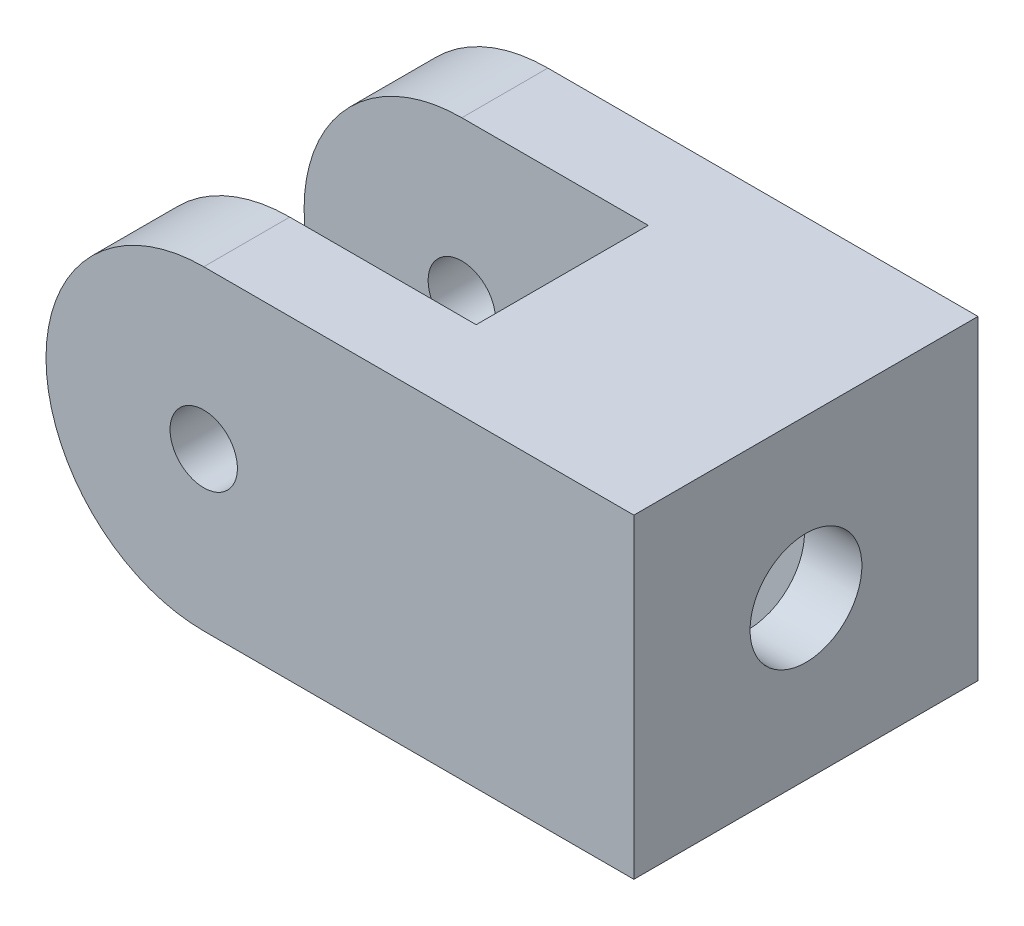
ISO-10303-21;
HEADER;
FILE_DESCRIPTION(('STEP AP214'),'2;1');
FILE_NAME('part.step','',(''),(''),'','','');
FILE_SCHEMA(('AUTOMOTIVE_DESIGN { 1 0 10303 214 1 1 1 1 }'));
ENDSEC;
DATA;
#1=APPLICATION_CONTEXT('core data for automotive mechanical design processes');
#2=APPLICATION_PROTOCOL_DEFINITION('international standard','automotive_design',2000,#1);
#3=PRODUCT_CONTEXT('',#1,'mechanical');
#4=PRODUCT('Part','Part','',(#3));
#5=PRODUCT_RELATED_PRODUCT_CATEGORY('part','',(#4));
#6=PRODUCT_DEFINITION_FORMATION('','',#4);
#7=PRODUCT_DEFINITION_CONTEXT('part definition',#1,'design');
#8=PRODUCT_DEFINITION('design','',#6,#7);
#9=PRODUCT_DEFINITION_SHAPE('','',#8);
#10=(LENGTH_UNIT() NAMED_UNIT(*) SI_UNIT(.MILLI.,.METRE.));
#11=(NAMED_UNIT(*) PLANE_ANGLE_UNIT() SI_UNIT($,.RADIAN.));
#12=(NAMED_UNIT(*) SI_UNIT($,.STERADIAN.) SOLID_ANGLE_UNIT());
#13=UNCERTAINTY_MEASURE_WITH_UNIT(LENGTH_MEASURE(1.E-05),#10,'distance_accuracy_value','');
#14=(GEOMETRIC_REPRESENTATION_CONTEXT(3) GLOBAL_UNCERTAINTY_ASSIGNED_CONTEXT((#13)) GLOBAL_UNIT_ASSIGNED_CONTEXT((#10,
#11,#12)) REPRESENTATION_CONTEXT('',''));
#15=CARTESIAN_POINT('',(0.,0.,0.));
#16=DIRECTION('',(0.,0.,1.));
#17=DIRECTION('',(1.,0.,0.));
#18=AXIS2_PLACEMENT_3D('',#15,#16,#17);
#19=CARTESIAN_POINT('',(30.,-11.,0.));
#20=DIRECTION('',(0.,-1.,0.));
#21=DIRECTION('',(0.,0.,-1.));
#22=AXIS2_PLACEMENT_3D('',#19,#20,#21);
#23=PLANE('',#22);
#24=DIRECTION('',(-1.,0.,0.));
#25=VECTOR('',#24,1.);
#26=CARTESIAN_POINT('',(13.,-11.,-18.));
#27=LINE('',#26,#25);
#28=CARTESIAN_POINT('',(13.,-11.,-18.));
#29=VERTEX_POINT('',#28);
#30=CARTESIAN_POINT('',(0.,-11.,-18.));
#31=VERTEX_POINT('',#30);
#32=EDGE_CURVE('E200',#29,#31,#27,.T.);
#33=ORIENTED_EDGE('',*,*,#32,.T.);
#34=DIRECTION('',(0.,0.,-1.));
#35=VECTOR('',#34,1.);
#36=CARTESIAN_POINT('',(0.,-11.,0.));
#37=LINE('',#36,#35);
#38=CARTESIAN_POINT('',(0.,-11.,-24.));
#39=VERTEX_POINT('',#38);
#40=EDGE_CURVE('E266',#31,#39,#37,.T.);
#41=ORIENTED_EDGE('',*,*,#40,.T.);
#42=DIRECTION('',(-1.,0.,0.));
#43=VECTOR('',#42,1.);
#44=CARTESIAN_POINT('',(30.,-11.,-24.));
#45=LINE('',#44,#43);
#46=CARTESIAN_POINT('',(30.,-11.,-24.));
#47=VERTEX_POINT('',#46);
#48=EDGE_CURVE('E236',#47,#39,#45,.T.);
#49=ORIENTED_EDGE('',*,*,#48,.F.);
#50=DIRECTION('',(0.,0.,-1.));
#51=VECTOR('',#50,1.);
#52=CARTESIAN_POINT('',(30.,-11.,0.));
#53=LINE('',#52,#51);
#54=CARTESIAN_POINT('',(30.,-11.,0.));
#55=VERTEX_POINT('',#54);
#56=EDGE_CURVE('E267',#55,#47,#53,.T.);
#57=ORIENTED_EDGE('',*,*,#56,.F.);
#58=DIRECTION('',(-1.,0.,0.));
#59=VECTOR('',#58,1.);
#60=CARTESIAN_POINT('',(30.,-11.,0.));
#61=LINE('',#60,#59);
#62=CARTESIAN_POINT('',(0.,-11.,0.));
#63=VERTEX_POINT('',#62);
#64=EDGE_CURVE('E244',#55,#63,#61,.T.);
#65=ORIENTED_EDGE('',*,*,#64,.T.);
#66=CARTESIAN_POINT('',(0.,-11.,-5.99999999999999));
#67=VERTEX_POINT('',#66);
#68=EDGE_CURVE('E48',#63,#67,#37,.T.);
#69=ORIENTED_EDGE('',*,*,#68,.T.);
#70=DIRECTION('',(1.,0.,0.));
#71=VECTOR('',#70,1.);
#72=CARTESIAN_POINT('',(-17.11080660068,-11.,-5.99999999999999));
#73=LINE('',#72,#71);
#74=CARTESIAN_POINT('',(13.,-11.,-5.99999999999999));
#75=VERTEX_POINT('',#74);
#76=EDGE_CURVE('E204',#67,#75,#73,.T.);
#77=ORIENTED_EDGE('',*,*,#76,.T.);
#78=DIRECTION('',(0.,0.,-1.));
#79=VECTOR('',#78,1.);
#80=CARTESIAN_POINT('',(13.,-11.,-5.99999999999999));
#81=LINE('',#80,#79);
#82=EDGE_CURVE('E209',#75,#29,#81,.T.);
#83=ORIENTED_EDGE('',*,*,#82,.T.);
#84=EDGE_LOOP('',(#33,#41,#49,#57,#65,#69,#77,#83));
#85=FACE_BOUND('',#84,.T.);
#86=DIRECTION('',(-1.,0.,0.));
#87=VECTOR('',#86,1.);
#88=CARTESIAN_POINT('',(26.,-11.,-5.5));
#89=LINE('',#88,#87);
#90=CARTESIAN_POINT('',(26.,-11.,-5.5));
#91=VERTEX_POINT('',#90);
#92=CARTESIAN_POINT('',(19.2,-11.,-5.5));
#93=VERTEX_POINT('',#92);
#94=EDGE_CURVE('E147',#91,#93,#89,.T.);
#95=ORIENTED_EDGE('',*,*,#94,.F.);
#96=DIRECTION('',(0.,0.,1.));
#97=VECTOR('',#96,1.);
#98=CARTESIAN_POINT('',(26.,-11.,-18.5));
#99=LINE('',#98,#97);
#100=CARTESIAN_POINT('',(26.,-11.,-18.5));
#101=VERTEX_POINT('',#100);
#102=EDGE_CURVE('E154',#101,#91,#99,.T.);
#103=ORIENTED_EDGE('',*,*,#102,.F.);
#104=DIRECTION('',(-1.,0.,0.));
#105=VECTOR('',#104,1.);
#106=CARTESIAN_POINT('',(26.,-11.,-18.5));
#107=LINE('',#106,#105);
#108=CARTESIAN_POINT('',(19.2,-11.,-18.5));
#109=VERTEX_POINT('',#108);
#110=EDGE_CURVE('E136',#101,#109,#107,.T.);
#111=ORIENTED_EDGE('',*,*,#110,.T.);
#112=DIRECTION('',(0.,0.,1.));
#113=VECTOR('',#112,1.);
#114=CARTESIAN_POINT('',(19.2,-11.,-18.5));
#115=LINE('',#114,#113);
#116=EDGE_CURVE('E175',#109,#93,#115,.T.);
#117=ORIENTED_EDGE('',*,*,#116,.T.);
#118=EDGE_LOOP('',(#95,#103,#111,#117));
#119=FACE_BOUND('',#118,.T.);
#120=ADVANCED_FACE('F39',(#85,#119),#23,.T.);
#121=CARTESIAN_POINT('',(0.,0.,0.));
#122=DIRECTION('',(0.,0.,-1.));
#123=DIRECTION('',(-1.,0.,0.));
#124=AXIS2_PLACEMENT_3D('',#121,#122,#123);
#125=CYLINDRICAL_SURFACE('',#124,11.);
#126=CARTESIAN_POINT('',(0.,0.,-18.));
#127=DIRECTION('',(0.,0.,-1.));
#128=DIRECTION('',(-1.,0.,0.));
#129=AXIS2_PLACEMENT_3D('',#126,#127,#128);
#130=CIRCLE('',#129,11.);
#131=CARTESIAN_POINT('',(0.,11.,-18.));
#132=VERTEX_POINT('',#131);
#133=EDGE_CURVE('E227',#132,#31,#130,.F.);
#134=ORIENTED_EDGE('',*,*,#133,.F.);
#135=DIRECTION('',(0.,0.,-1.));
#136=VECTOR('',#135,1.);
#137=CARTESIAN_POINT('',(0.,11.,0.));
#138=LINE('',#137,#136);
#139=CARTESIAN_POINT('',(0.,11.,-24.));
#140=VERTEX_POINT('',#139);
#141=EDGE_CURVE('E248',#132,#140,#138,.T.);
#142=ORIENTED_EDGE('',*,*,#141,.T.);
#143=CARTESIAN_POINT('',(0.,0.,-24.));
#144=DIRECTION('',(0.,0.,-1.));
#145=DIRECTION('',(-1.,0.,0.));
#146=AXIS2_PLACEMENT_3D('',#143,#144,#145);
#147=CIRCLE('',#146,11.);
#148=EDGE_CURVE('E230',#39,#140,#147,.T.);
#149=ORIENTED_EDGE('',*,*,#148,.F.);
#150=ORIENTED_EDGE('',*,*,#40,.F.);
#151=EDGE_LOOP('',(#134,#142,#149,#150));
#152=FACE_BOUND('',#151,.T.);
#153=ADVANCED_FACE('F282',(#152),#125,.T.);
#154=CARTESIAN_POINT('',(0.,0.,-5.99999999999999));
#155=DIRECTION('',(0.,0.,1.));
#156=DIRECTION('',(1.,0.,0.));
#157=AXIS2_PLACEMENT_3D('',#154,#155,#156);
#158=CIRCLE('',#157,11.);
#159=CARTESIAN_POINT('',(0.,11.,-5.99999999999999));
#160=VERTEX_POINT('',#159);
#161=EDGE_CURVE('E62',#67,#160,#158,.F.);
#162=ORIENTED_EDGE('',*,*,#161,.F.);
#163=ORIENTED_EDGE('',*,*,#68,.F.);
#164=CARTESIAN_POINT('',(0.,0.,0.));
#165=DIRECTION('',(0.,0.,-1.));
#166=DIRECTION('',(-1.,0.,0.));
#167=AXIS2_PLACEMENT_3D('',#164,#165,#166);
#168=CIRCLE('',#167,11.);
#169=CARTESIAN_POINT('',(0.,11.,0.));
#170=VERTEX_POINT('',#169);
#171=EDGE_CURVE('E231',#63,#170,#168,.T.);
#172=ORIENTED_EDGE('',*,*,#171,.T.);
#173=EDGE_CURVE('E272',#170,#160,#138,.T.);
#174=ORIENTED_EDGE('',*,*,#173,.T.);
#175=EDGE_LOOP('',(#162,#163,#172,#174));
#176=FACE_BOUND('',#175,.T.);
#177=ADVANCED_FACE('F41',(#176),#125,.T.);
#178=CARTESIAN_POINT('',(30.,11.,0.));
#179=DIRECTION('',(1.,0.,0.));
#180=DIRECTION('',(0.,0.,-1.));
#181=AXIS2_PLACEMENT_3D('',#178,#179,#180);
#182=PLANE('',#181);
#183=CARTESIAN_POINT('',(30.,0.,-12.));
#184=DIRECTION('',(-1.,0.,0.));
#185=DIRECTION('',(0.,0.,1.));
#186=AXIS2_PLACEMENT_3D('',#183,#184,#185);
#187=CIRCLE('',#186,3.9);
#188=CARTESIAN_POINT('',(30.,0.,-8.1));
#189=VERTEX_POINT('',#188);
#190=EDGE_CURVE('E400',#189,#189,#187,.T.);
#191=ORIENTED_EDGE('',*,*,#190,.T.);
#192=EDGE_LOOP('',(#191));
#193=FACE_BOUND('',#192,.T.);
#194=DIRECTION('',(0.,-1.,0.));
#195=VECTOR('',#194,1.);
#196=CARTESIAN_POINT('',(30.,11.,-24.));
#197=LINE('',#196,#195);
#198=CARTESIAN_POINT('',(30.,11.,-24.));
#199=VERTEX_POINT('',#198);
#200=EDGE_CURVE('E256',#199,#47,#197,.T.);
#201=ORIENTED_EDGE('',*,*,#200,.F.);
#202=DIRECTION('',(0.,0.,-1.));
#203=VECTOR('',#202,1.);
#204=CARTESIAN_POINT('',(30.,11.,0.));
#205=LINE('',#204,#203);
#206=CARTESIAN_POINT('',(30.,11.,0.));
#207=VERTEX_POINT('',#206);
#208=EDGE_CURVE('E270',#207,#199,#205,.T.);
#209=ORIENTED_EDGE('',*,*,#208,.F.);
#210=DIRECTION('',(0.,-1.,0.));
#211=VECTOR('',#210,1.);
#212=CARTESIAN_POINT('',(30.,11.,0.));
#213=LINE('',#212,#211);
#214=EDGE_CURVE('E240',#207,#55,#213,.T.);
#215=ORIENTED_EDGE('',*,*,#214,.T.);
#216=ORIENTED_EDGE('',*,*,#56,.T.);
#217=EDGE_LOOP('',(#201,#209,#215,#216));
#218=FACE_BOUND('',#217,.T.);
#219=ADVANCED_FACE('F308',(#193,#218),#182,.T.);
#220=CARTESIAN_POINT('',(0.,11.,0.));
#221=DIRECTION('',(0.,1.,0.));
#222=DIRECTION('',(0.,0.,1.));
#223=AXIS2_PLACEMENT_3D('',#220,#221,#222);
#224=PLANE('',#223);
#225=DIRECTION('',(-1.,0.,0.));
#226=VECTOR('',#225,1.);
#227=CARTESIAN_POINT('',(13.,11.,-18.));
#228=LINE('',#227,#226);
#229=CARTESIAN_POINT('',(13.,11.,-18.));
#230=VERTEX_POINT('',#229);
#231=EDGE_CURVE('E191',#230,#132,#228,.T.);
#232=ORIENTED_EDGE('',*,*,#231,.F.);
#233=DIRECTION('',(0.,0.,-1.));
#234=VECTOR('',#233,1.);
#235=CARTESIAN_POINT('',(13.,11.,-5.99999999999999));
#236=LINE('',#235,#234);
#237=CARTESIAN_POINT('',(13.,11.,-5.99999999999999));
#238=VERTEX_POINT('',#237);
#239=EDGE_CURVE('E205',#238,#230,#236,.T.);
#240=ORIENTED_EDGE('',*,*,#239,.F.);
#241=DIRECTION('',(1.,0.,0.));
#242=VECTOR('',#241,1.);
#243=CARTESIAN_POINT('',(0.,11.,-5.99999999999999));
#244=LINE('',#243,#242);
#245=EDGE_CURVE('E11',#160,#238,#244,.T.);
#246=ORIENTED_EDGE('',*,*,#245,.F.);
#247=ORIENTED_EDGE('',*,*,#173,.F.);
#248=DIRECTION('',(1.,0.,0.));
#249=VECTOR('',#248,1.);
#250=CARTESIAN_POINT('',(0.,11.,0.));
#251=LINE('',#250,#249);
#252=EDGE_CURVE('E235',#170,#207,#251,.T.);
#253=ORIENTED_EDGE('',*,*,#252,.T.);
#254=ORIENTED_EDGE('',*,*,#208,.T.);
#255=DIRECTION('',(1.,0.,0.));
#256=VECTOR('',#255,1.);
#257=CARTESIAN_POINT('',(0.,11.,-24.));
#258=LINE('',#257,#256);
#259=EDGE_CURVE('E252',#140,#199,#258,.T.);
#260=ORIENTED_EDGE('',*,*,#259,.F.);
#261=ORIENTED_EDGE('',*,*,#141,.F.);
#262=EDGE_LOOP('',(#232,#240,#246,#247,#253,#254,#260,#261));
#263=FACE_BOUND('',#262,.T.);
#264=ADVANCED_FACE('F286',(#263),#224,.T.);
#265=CARTESIAN_POINT('',(0.,0.,0.));
#266=DIRECTION('',(0.,0.,-1.));
#267=DIRECTION('',(-1.,0.,0.));
#268=AXIS2_PLACEMENT_3D('',#265,#266,#267);
#269=PLANE('',#268);
#270=CARTESIAN_POINT('',(0.,0.,0.));
#271=DIRECTION('',(0.,0.,-1.));
#272=DIRECTION('',(-1.,0.,0.));
#273=AXIS2_PLACEMENT_3D('',#270,#271,#272);
#274=CIRCLE('',#273,2.35);
#275=CARTESIAN_POINT('',(-2.35,0.,0.));
#276=VERTEX_POINT('',#275);
#277=EDGE_CURVE('E379',#276,#276,#274,.T.);
#278=ORIENTED_EDGE('',*,*,#277,.T.);
#279=EDGE_LOOP('',(#278));
#280=FACE_BOUND('',#279,.T.);
#281=ORIENTED_EDGE('',*,*,#171,.F.);
#282=ORIENTED_EDGE('',*,*,#64,.F.);
#283=ORIENTED_EDGE('',*,*,#214,.F.);
#284=ORIENTED_EDGE('',*,*,#252,.F.);
#285=EDGE_LOOP('',(#281,#282,#283,#284));
#286=FACE_BOUND('',#285,.T.);
#287=ADVANCED_FACE('F305',(#280,#286),#269,.F.);
#288=CARTESIAN_POINT('',(0.,0.,-24.));
#289=DIRECTION('',(0.,0.,-1.));
#290=DIRECTION('',(-1.,0.,0.));
#291=AXIS2_PLACEMENT_3D('',#288,#289,#290);
#292=PLANE('',#291);
#293=CARTESIAN_POINT('',(0.,0.,-24.));
#294=DIRECTION('',(0.,0.,-1.));
#295=DIRECTION('',(-1.,0.,0.));
#296=AXIS2_PLACEMENT_3D('',#293,#294,#295);
#297=CIRCLE('',#296,2.35);
#298=CARTESIAN_POINT('',(-2.35,0.,-24.));
#299=VERTEX_POINT('',#298);
#300=EDGE_CURVE('E386',#299,#299,#297,.T.);
#301=ORIENTED_EDGE('',*,*,#300,.F.);
#302=EDGE_LOOP('',(#301));
#303=FACE_BOUND('',#302,.T.);
#304=ORIENTED_EDGE('',*,*,#148,.T.);
#305=ORIENTED_EDGE('',*,*,#259,.T.);
#306=ORIENTED_EDGE('',*,*,#200,.T.);
#307=ORIENTED_EDGE('',*,*,#48,.T.);
#308=EDGE_LOOP('',(#304,#305,#306,#307));
#309=FACE_BOUND('',#308,.T.);
#310=ADVANCED_FACE('F289',(#303,#309),#292,.T.);
#311=CARTESIAN_POINT('',(13.,-11.,-18.));
#312=DIRECTION('',(0.,0.,-1.));
#313=DIRECTION('',(-1.,0.,0.));
#314=AXIS2_PLACEMENT_3D('',#311,#312,#313);
#315=PLANE('',#314);
#316=CARTESIAN_POINT('',(0.,0.,-18.));
#317=DIRECTION('',(0.,0.,-1.));
#318=DIRECTION('',(-1.,0.,0.));
#319=AXIS2_PLACEMENT_3D('',#316,#317,#318);
#320=CIRCLE('',#319,2.35);
#321=CARTESIAN_POINT('',(-2.35,0.,-18.));
#322=VERTEX_POINT('',#321);
#323=EDGE_CURVE('E392',#322,#322,#320,.T.);
#324=ORIENTED_EDGE('',*,*,#323,.T.);
#325=EDGE_LOOP('',(#324));
#326=FACE_BOUND('',#325,.T.);
#327=ORIENTED_EDGE('',*,*,#133,.T.);
#328=ORIENTED_EDGE('',*,*,#32,.F.);
#329=DIRECTION('',(0.,1.,0.));
#330=VECTOR('',#329,1.);
#331=CARTESIAN_POINT('',(13.,-11.,-18.));
#332=LINE('',#331,#330);
#333=EDGE_CURVE('E219',#29,#230,#332,.T.);
#334=ORIENTED_EDGE('',*,*,#333,.T.);
#335=ORIENTED_EDGE('',*,*,#231,.T.);
#336=EDGE_LOOP('',(#327,#328,#334,#335));
#337=FACE_BOUND('',#336,.T.);
#338=ADVANCED_FACE('F296',(#326,#337),#315,.F.);
#339=CARTESIAN_POINT('',(13.,-11.,-5.99999999999999));
#340=DIRECTION('',(1.,0.,0.));
#341=DIRECTION('',(0.,0.,-1.));
#342=AXIS2_PLACEMENT_3D('',#339,#340,#341);
#343=PLANE('',#342);
#344=CARTESIAN_POINT('',(13.,0.,-12.));
#345=DIRECTION('',(-1.,0.,0.));
#346=DIRECTION('',(0.,0.,1.));
#347=AXIS2_PLACEMENT_3D('',#344,#345,#346);
#348=CIRCLE('',#347,3.9);
#349=CARTESIAN_POINT('',(13.,0.,-8.1));
#350=VERTEX_POINT('',#349);
#351=EDGE_CURVE('E403',#350,#350,#348,.T.);
#352=ORIENTED_EDGE('',*,*,#351,.F.);
#353=EDGE_LOOP('',(#352));
#354=FACE_BOUND('',#353,.T.);
#355=ORIENTED_EDGE('',*,*,#239,.T.);
#356=ORIENTED_EDGE('',*,*,#333,.F.);
#357=ORIENTED_EDGE('',*,*,#82,.F.);
#358=DIRECTION('',(0.,1.,0.));
#359=VECTOR('',#358,1.);
#360=CARTESIAN_POINT('',(13.,-11.,-5.99999999999999));
#361=LINE('',#360,#359);
#362=EDGE_CURVE('E213',#75,#238,#361,.T.);
#363=ORIENTED_EDGE('',*,*,#362,.T.);
#364=EDGE_LOOP('',(#355,#356,#357,#363));
#365=FACE_BOUND('',#364,.T.);
#366=ADVANCED_FACE('F299',(#354,#365),#343,.F.);
#367=CARTESIAN_POINT('',(-17.11080660068,-11.,-5.99999999999999));
#368=DIRECTION('',(0.,0.,1.));
#369=DIRECTION('',(1.,0.,0.));
#370=AXIS2_PLACEMENT_3D('',#367,#368,#369);
#371=PLANE('',#370);
#372=CARTESIAN_POINT('',(0.,0.,-5.99999999999999));
#373=DIRECTION('',(0.,0.,-1.));
#374=DIRECTION('',(-1.,0.,0.));
#375=AXIS2_PLACEMENT_3D('',#372,#373,#374);
#376=CIRCLE('',#375,2.35);
#377=CARTESIAN_POINT('',(-2.35,0.,-5.99999999999999));
#378=VERTEX_POINT('',#377);
#379=EDGE_CURVE('E382',#378,#378,#376,.T.);
#380=ORIENTED_EDGE('',*,*,#379,.F.);
#381=EDGE_LOOP('',(#380));
#382=FACE_BOUND('',#381,.T.);
#383=ORIENTED_EDGE('',*,*,#161,.T.);
#384=ORIENTED_EDGE('',*,*,#245,.T.);
#385=ORIENTED_EDGE('',*,*,#362,.F.);
#386=ORIENTED_EDGE('',*,*,#76,.F.);
#387=EDGE_LOOP('',(#383,#384,#385,#386));
#388=FACE_BOUND('',#387,.T.);
#389=ADVANCED_FACE('F300',(#382,#388),#371,.F.);
#390=CARTESIAN_POINT('',(26.,3.75277674973258,-18.5));
#391=DIRECTION('',(0.,0.,-1.));
#392=DIRECTION('',(-1.,0.,0.));
#393=AXIS2_PLACEMENT_3D('',#390,#391,#392);
#394=PLANE('',#393);
#395=DIRECTION('',(0.,-1.,0.));
#396=VECTOR('',#395,1.);
#397=CARTESIAN_POINT('',(19.2,3.75277674973258,-18.5));
#398=LINE('',#397,#396);
#399=CARTESIAN_POINT('',(19.2,3.75277674973258,-18.5));
#400=VERTEX_POINT('',#399);
#401=EDGE_CURVE('E142',#400,#109,#398,.T.);
#402=ORIENTED_EDGE('',*,*,#401,.T.);
#403=ORIENTED_EDGE('',*,*,#110,.F.);
#404=DIRECTION('',(0.,-1.,0.));
#405=VECTOR('',#404,1.);
#406=CARTESIAN_POINT('',(26.,3.75277674973258,-18.5));
#407=LINE('',#406,#405);
#408=CARTESIAN_POINT('',(26.,3.75277674973258,-18.5));
#409=VERTEX_POINT('',#408);
#410=EDGE_CURVE('E139',#409,#101,#407,.T.);
#411=ORIENTED_EDGE('',*,*,#410,.F.);
#412=DIRECTION('',(-1.,0.,0.));
#413=VECTOR('',#412,1.);
#414=CARTESIAN_POINT('',(26.,3.75277674973258,-18.5));
#415=LINE('',#414,#413);
#416=EDGE_CURVE('E188',#409,#400,#415,.T.);
#417=ORIENTED_EDGE('',*,*,#416,.T.);
#418=EDGE_LOOP('',(#402,#403,#411,#417));
#419=FACE_BOUND('',#418,.T.);
#420=ADVANCED_FACE('F138',(#419),#394,.F.);
#421=CARTESIAN_POINT('',(26.,7.50555349946514,-12.));
#422=DIRECTION('',(0.,0.866025403784439,-0.5));
#423=DIRECTION('',(0.,0.5,0.866025403784439));
#424=AXIS2_PLACEMENT_3D('',#421,#422,#423);
#425=PLANE('',#424);
#426=DIRECTION('',(0.,-0.5,-0.866025403784439));
#427=VECTOR('',#426,1.);
#428=CARTESIAN_POINT('',(19.2,7.50555349946514,-12.));
#429=LINE('',#428,#427);
#430=CARTESIAN_POINT('',(19.2,7.50555349946514,-12.));
#431=VERTEX_POINT('',#430);
#432=EDGE_CURVE('E159',#431,#400,#429,.T.);
#433=ORIENTED_EDGE('',*,*,#432,.T.);
#434=ORIENTED_EDGE('',*,*,#416,.F.);
#435=DIRECTION('',(0.,-0.5,-0.866025403784439));
#436=VECTOR('',#435,1.);
#437=CARTESIAN_POINT('',(26.,7.50555349946514,-12.));
#438=LINE('',#437,#436);
#439=CARTESIAN_POINT('',(26.,7.50555349946514,-12.));
#440=VERTEX_POINT('',#439);
#441=EDGE_CURVE('E148',#440,#409,#438,.T.);
#442=ORIENTED_EDGE('',*,*,#441,.F.);
#443=DIRECTION('',(-1.,0.,0.));
#444=VECTOR('',#443,1.);
#445=CARTESIAN_POINT('',(26.,7.50555349946514,-12.));
#446=LINE('',#445,#444);
#447=EDGE_CURVE('E192',#440,#431,#446,.T.);
#448=ORIENTED_EDGE('',*,*,#447,.T.);
#449=EDGE_LOOP('',(#433,#434,#442,#448));
#450=FACE_BOUND('',#449,.T.);
#451=ADVANCED_FACE('F340',(#450),#425,.F.);
#452=CARTESIAN_POINT('',(26.,3.75277674973257,-5.5));
#453=DIRECTION('',(0.,0.866025403784439,0.5));
#454=DIRECTION('',(0.,-0.5,0.866025403784438));
#455=AXIS2_PLACEMENT_3D('',#452,#453,#454);
#456=PLANE('',#455);
#457=DIRECTION('',(0.,0.5,-0.866025403784439));
#458=VECTOR('',#457,1.);
#459=CARTESIAN_POINT('',(19.2,3.75277674973257,-5.5));
#460=LINE('',#459,#458);
#461=CARTESIAN_POINT('',(19.2,3.75277674973257,-5.5));
#462=VERTEX_POINT('',#461);
#463=EDGE_CURVE('E181',#462,#431,#460,.T.);
#464=ORIENTED_EDGE('',*,*,#463,.T.);
#465=ORIENTED_EDGE('',*,*,#447,.F.);
#466=DIRECTION('',(0.,0.5,-0.866025403784439));
#467=VECTOR('',#466,1.);
#468=CARTESIAN_POINT('',(26.,3.75277674973257,-5.5));
#469=LINE('',#468,#467);
#470=CARTESIAN_POINT('',(26.,3.75277674973257,-5.5));
#471=VERTEX_POINT('',#470);
#472=EDGE_CURVE('E165',#471,#440,#469,.T.);
#473=ORIENTED_EDGE('',*,*,#472,.F.);
#474=DIRECTION('',(-1.,0.,0.));
#475=VECTOR('',#474,1.);
#476=CARTESIAN_POINT('',(26.,3.75277674973257,-5.5));
#477=LINE('',#476,#475);
#478=EDGE_CURVE('E195',#471,#462,#477,.T.);
#479=ORIENTED_EDGE('',*,*,#478,.T.);
#480=EDGE_LOOP('',(#464,#465,#473,#479));
#481=FACE_BOUND('',#480,.T.);
#482=ADVANCED_FACE('F344',(#481),#456,.F.);
#483=CARTESIAN_POINT('',(26.,-11.,-5.5));
#484=DIRECTION('',(0.,0.,1.));
#485=DIRECTION('',(1.,0.,0.));
#486=AXIS2_PLACEMENT_3D('',#483,#484,#485);
#487=PLANE('',#486);
#488=DIRECTION('',(0.,1.,0.));
#489=VECTOR('',#488,1.);
#490=CARTESIAN_POINT('',(19.2,-11.,-5.5));
#491=LINE('',#490,#489);
#492=EDGE_CURVE('E55',#93,#462,#491,.T.);
#493=ORIENTED_EDGE('',*,*,#492,.T.);
#494=ORIENTED_EDGE('',*,*,#478,.F.);
#495=DIRECTION('',(0.,1.,0.));
#496=VECTOR('',#495,1.);
#497=CARTESIAN_POINT('',(26.,-11.,-5.5));
#498=LINE('',#497,#496);
#499=EDGE_CURVE('E162',#91,#471,#498,.T.);
#500=ORIENTED_EDGE('',*,*,#499,.F.);
#501=ORIENTED_EDGE('',*,*,#94,.T.);
#502=EDGE_LOOP('',(#493,#494,#500,#501));
#503=FACE_BOUND('',#502,.T.);
#504=ADVANCED_FACE('F341',(#503),#487,.F.);
#505=CARTESIAN_POINT('',(26.,0.,0.));
#506=DIRECTION('',(-1.,0.,0.));
#507=DIRECTION('',(0.,0.,1.));
#508=AXIS2_PLACEMENT_3D('',#505,#506,#507);
#509=PLANE('',#508);
#510=CARTESIAN_POINT('',(26.,0.,-12.));
#511=DIRECTION('',(-1.,0.,0.));
#512=DIRECTION('',(0.,0.,1.));
#513=AXIS2_PLACEMENT_3D('',#510,#511,#512);
#514=CIRCLE('',#513,3.9);
#515=CARTESIAN_POINT('',(26.,0.,-8.1));
#516=VERTEX_POINT('',#515);
#517=EDGE_CURVE('E396',#516,#516,#514,.T.);
#518=ORIENTED_EDGE('',*,*,#517,.F.);
#519=EDGE_LOOP('',(#518));
#520=FACE_BOUND('',#519,.T.);
#521=ORIENTED_EDGE('',*,*,#410,.T.);
#522=ORIENTED_EDGE('',*,*,#102,.T.);
#523=ORIENTED_EDGE('',*,*,#499,.T.);
#524=ORIENTED_EDGE('',*,*,#472,.T.);
#525=ORIENTED_EDGE('',*,*,#441,.T.);
#526=EDGE_LOOP('',(#521,#522,#523,#524,#525));
#527=FACE_BOUND('',#526,.T.);
#528=ADVANCED_FACE('F152',(#520,#527),#509,.T.);
#529=CARTESIAN_POINT('',(19.2,0.,0.));
#530=DIRECTION('',(-1.,0.,0.));
#531=DIRECTION('',(0.,0.,1.));
#532=AXIS2_PLACEMENT_3D('',#529,#530,#531);
#533=PLANE('',#532);
#534=CARTESIAN_POINT('',(19.2,0.,-12.));
#535=DIRECTION('',(-1.,0.,0.));
#536=DIRECTION('',(0.,0.,1.));
#537=AXIS2_PLACEMENT_3D('',#534,#535,#536);
#538=CIRCLE('',#537,3.9);
#539=CARTESIAN_POINT('',(19.2,0.,-8.1));
#540=VERTEX_POINT('',#539);
#541=EDGE_CURVE('E176',#540,#540,#538,.T.);
#542=ORIENTED_EDGE('',*,*,#541,.T.);
#543=EDGE_LOOP('',(#542));
#544=FACE_BOUND('',#543,.T.);
#545=ORIENTED_EDGE('',*,*,#401,.F.);
#546=ORIENTED_EDGE('',*,*,#432,.F.);
#547=ORIENTED_EDGE('',*,*,#463,.F.);
#548=ORIENTED_EDGE('',*,*,#492,.F.);
#549=ORIENTED_EDGE('',*,*,#116,.F.);
#550=EDGE_LOOP('',(#545,#546,#547,#548,#549));
#551=FACE_BOUND('',#550,.T.);
#552=ADVANCED_FACE('F352',(#544,#551),#533,.F.);
#553=CARTESIAN_POINT('',(13.,0.,-12.));
#554=DIRECTION('',(-1.,0.,0.));
#555=DIRECTION('',(0.,0.,1.));
#556=AXIS2_PLACEMENT_3D('',#553,#554,#555);
#557=CYLINDRICAL_SURFACE('',#556,3.9);
#558=ORIENTED_EDGE('',*,*,#541,.F.);
#559=EDGE_LOOP('',(#558));
#560=FACE_BOUND('',#559,.T.);
#561=ORIENTED_EDGE('',*,*,#351,.T.);
#562=EDGE_LOOP('',(#561));
#563=FACE_BOUND('',#562,.T.);
#564=ADVANCED_FACE('F355',(#560,#563),#557,.F.);
#565=CARTESIAN_POINT('',(26.,0.,-12.));
#566=DIRECTION('',(-1.,0.,0.));
#567=DIRECTION('',(0.,0.,1.));
#568=AXIS2_PLACEMENT_3D('',#565,#566,#567);
#569=CYLINDRICAL_SURFACE('',#568,3.9);
#570=ORIENTED_EDGE('',*,*,#190,.F.);
#571=EDGE_LOOP('',(#570));
#572=FACE_BOUND('',#571,.T.);
#573=ORIENTED_EDGE('',*,*,#517,.T.);
#574=EDGE_LOOP('',(#573));
#575=FACE_BOUND('',#574,.T.);
#576=ADVANCED_FACE('F362',(#572,#575),#569,.F.);
#577=CARTESIAN_POINT('',(0.,0.,-24.));
#578=DIRECTION('',(0.,0.,-1.));
#579=DIRECTION('',(-1.,0.,0.));
#580=AXIS2_PLACEMENT_3D('',#577,#578,#579);
#581=CYLINDRICAL_SURFACE('',#580,2.35);
#582=ORIENTED_EDGE('',*,*,#323,.F.);
#583=EDGE_LOOP('',(#582));
#584=FACE_BOUND('',#583,.T.);
#585=ORIENTED_EDGE('',*,*,#300,.T.);
#586=EDGE_LOOP('',(#585));
#587=FACE_BOUND('',#586,.T.);
#588=ADVANCED_FACE('F366',(#584,#587),#581,.F.);
#589=CARTESIAN_POINT('',(0.,0.,-5.99999999999999));
#590=DIRECTION('',(0.,0.,-1.));
#591=DIRECTION('',(-1.,0.,0.));
#592=AXIS2_PLACEMENT_3D('',#589,#590,#591);
#593=CYLINDRICAL_SURFACE('',#592,2.35);
#594=ORIENTED_EDGE('',*,*,#277,.F.);
#595=EDGE_LOOP('',(#594));
#596=FACE_BOUND('',#595,.T.);
#597=ORIENTED_EDGE('',*,*,#379,.T.);
#598=EDGE_LOOP('',(#597));
#599=FACE_BOUND('',#598,.T.);
#600=ADVANCED_FACE('F370',(#596,#599),#593,.F.);
#601=CLOSED_SHELL('',(#120,#153,#177,#219,#264,#287,#310,#338,#366,#389,#420,#451,#482,#504,
#528,#552,#564,#576,#588,#600));
#602=MANIFOLD_SOLID_BREP('B2',#601);
#603=ADVANCED_BREP_SHAPE_REPRESENTATION('',(#18,#602),#14);
#604=SHAPE_DEFINITION_REPRESENTATION(#9,#603);
ENDSEC;
END-ISO-10303-21;
